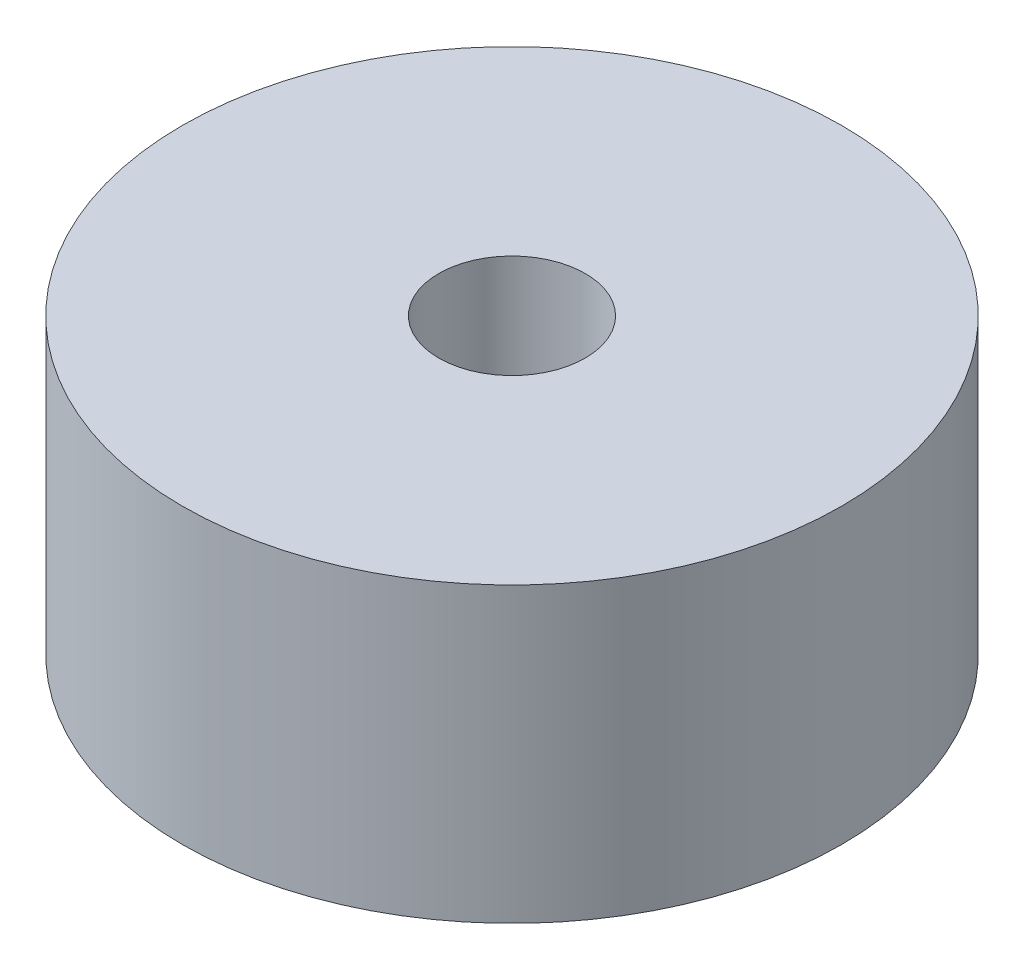
ISO-10303-21;
HEADER;
FILE_DESCRIPTION(('STEP AP214'),'2;1');
FILE_NAME('part.step','',(''),(''),'','','');
FILE_SCHEMA(('AUTOMOTIVE_DESIGN { 1 0 10303 214 1 1 1 1 }'));
ENDSEC;
DATA;
#1=APPLICATION_CONTEXT('core data for automotive mechanical design processes');
#2=APPLICATION_PROTOCOL_DEFINITION('international standard','automotive_design',2000,#1);
#3=PRODUCT_CONTEXT('',#1,'mechanical');
#4=PRODUCT('Part','Part','',(#3));
#5=PRODUCT_RELATED_PRODUCT_CATEGORY('part','',(#4));
#6=PRODUCT_DEFINITION_FORMATION('','',#4);
#7=PRODUCT_DEFINITION_CONTEXT('part definition',#1,'design');
#8=PRODUCT_DEFINITION('design','',#6,#7);
#9=PRODUCT_DEFINITION_SHAPE('','',#8);
#10=(LENGTH_UNIT() NAMED_UNIT(*) SI_UNIT(.MILLI.,.METRE.));
#11=(NAMED_UNIT(*) PLANE_ANGLE_UNIT() SI_UNIT($,.RADIAN.));
#12=(NAMED_UNIT(*) SI_UNIT($,.STERADIAN.) SOLID_ANGLE_UNIT());
#13=UNCERTAINTY_MEASURE_WITH_UNIT(LENGTH_MEASURE(1.E-05),#10,'distance_accuracy_value','');
#14=(GEOMETRIC_REPRESENTATION_CONTEXT(3) GLOBAL_UNCERTAINTY_ASSIGNED_CONTEXT((#13)) GLOBAL_UNIT_ASSIGNED_CONTEXT((#10,
#11,#12)) REPRESENTATION_CONTEXT('',''));
#15=CARTESIAN_POINT('',(0.,0.,0.));
#16=DIRECTION('',(0.,0.,1.));
#17=DIRECTION('',(1.,0.,0.));
#18=AXIS2_PLACEMENT_3D('',#15,#16,#17);
#19=CARTESIAN_POINT('',(0.,16.,0.));
#20=DIRECTION('',(0.,1.,0.));
#21=DIRECTION('',(0.,0.,1.));
#22=AXIS2_PLACEMENT_3D('',#19,#20,#21);
#23=PLANE('',#22);
#24=CARTESIAN_POINT('',(0.,16.,0.));
#25=DIRECTION('',(0.,1.,0.));
#26=DIRECTION('',(0.,0.,1.));
#27=AXIS2_PLACEMENT_3D('',#24,#25,#26);
#28=CIRCLE('',#27,18.);
#29=CARTESIAN_POINT('',(0.,16.,18.));
#30=VERTEX_POINT('',#29);
#31=EDGE_CURVE('E10',#30,#30,#28,.T.);
#32=ORIENTED_EDGE('',*,*,#31,.T.);
#33=EDGE_LOOP('',(#32));
#34=FACE_BOUND('',#33,.T.);
#35=CARTESIAN_POINT('',(0.,16.,0.));
#36=DIRECTION('',(0.,1.,0.));
#37=DIRECTION('',(0.,0.,1.));
#38=AXIS2_PLACEMENT_3D('',#35,#36,#37);
#39=CIRCLE('',#38,4.);
#40=CARTESIAN_POINT('',(0.,16.,4.));
#41=VERTEX_POINT('',#40);
#42=EDGE_CURVE('E57',#41,#41,#39,.T.);
#43=ORIENTED_EDGE('',*,*,#42,.F.);
#44=EDGE_LOOP('',(#43));
#45=FACE_BOUND('',#44,.T.);
#46=ADVANCED_FACE('F43',(#34,#45),#23,.T.);
#47=CARTESIAN_POINT('',(0.,0.,0.));
#48=DIRECTION('',(0.,1.,0.));
#49=DIRECTION('',(0.,0.,1.));
#50=AXIS2_PLACEMENT_3D('',#47,#48,#49);
#51=PLANE('',#50);
#52=CARTESIAN_POINT('',(0.,0.,0.));
#53=DIRECTION('',(0.,1.,0.));
#54=DIRECTION('',(0.,0.,1.));
#55=AXIS2_PLACEMENT_3D('',#52,#53,#54);
#56=CIRCLE('',#55,18.);
#57=CARTESIAN_POINT('',(0.,0.,18.));
#58=VERTEX_POINT('',#57);
#59=EDGE_CURVE('E50',#58,#58,#56,.T.);
#60=ORIENTED_EDGE('',*,*,#59,.F.);
#61=EDGE_LOOP('',(#60));
#62=FACE_BOUND('',#61,.T.);
#63=CARTESIAN_POINT('',(0.,0.,0.));
#64=DIRECTION('',(0.,1.,0.));
#65=DIRECTION('',(0.,0.,1.));
#66=AXIS2_PLACEMENT_3D('',#63,#64,#65);
#67=CIRCLE('',#66,4.);
#68=CARTESIAN_POINT('',(0.,0.,4.));
#69=VERTEX_POINT('',#68);
#70=EDGE_CURVE('E59',#69,#69,#67,.T.);
#71=ORIENTED_EDGE('',*,*,#70,.T.);
#72=EDGE_LOOP('',(#71));
#73=FACE_BOUND('',#72,.T.);
#74=ADVANCED_FACE('F69',(#62,#73),#51,.F.);
#75=CARTESIAN_POINT('',(0.,16.,0.));
#76=DIRECTION('',(0.,-1.,0.));
#77=DIRECTION('',(0.,0.,-1.));
#78=AXIS2_PLACEMENT_3D('',#75,#76,#77);
#79=CYLINDRICAL_SURFACE('',#78,18.);
#80=ORIENTED_EDGE('',*,*,#31,.F.);
#81=EDGE_LOOP('',(#80));
#82=FACE_BOUND('',#81,.T.);
#83=ORIENTED_EDGE('',*,*,#59,.T.);
#84=EDGE_LOOP('',(#83));
#85=FACE_BOUND('',#84,.T.);
#86=ADVANCED_FACE('F44',(#82,#85),#79,.T.);
#87=CARTESIAN_POINT('',(0.,16.,0.));
#88=DIRECTION('',(0.,-1.,0.));
#89=DIRECTION('',(0.,0.,-1.));
#90=AXIS2_PLACEMENT_3D('',#87,#88,#89);
#91=CYLINDRICAL_SURFACE('',#90,4.);
#92=ORIENTED_EDGE('',*,*,#42,.T.);
#93=EDGE_LOOP('',(#92));
#94=FACE_BOUND('',#93,.T.);
#95=ORIENTED_EDGE('',*,*,#70,.F.);
#96=EDGE_LOOP('',(#95));
#97=FACE_BOUND('',#96,.T.);
#98=ADVANCED_FACE('F66',(#94,#97),#91,.F.);
#99=CLOSED_SHELL('',(#46,#74,#86,#98));
#100=MANIFOLD_SOLID_BREP('B2',#99);
#101=ADVANCED_BREP_SHAPE_REPRESENTATION('',(#18,#100),#14);
#102=SHAPE_DEFINITION_REPRESENTATION(#9,#101);
ENDSEC;
END-ISO-10303-21;
